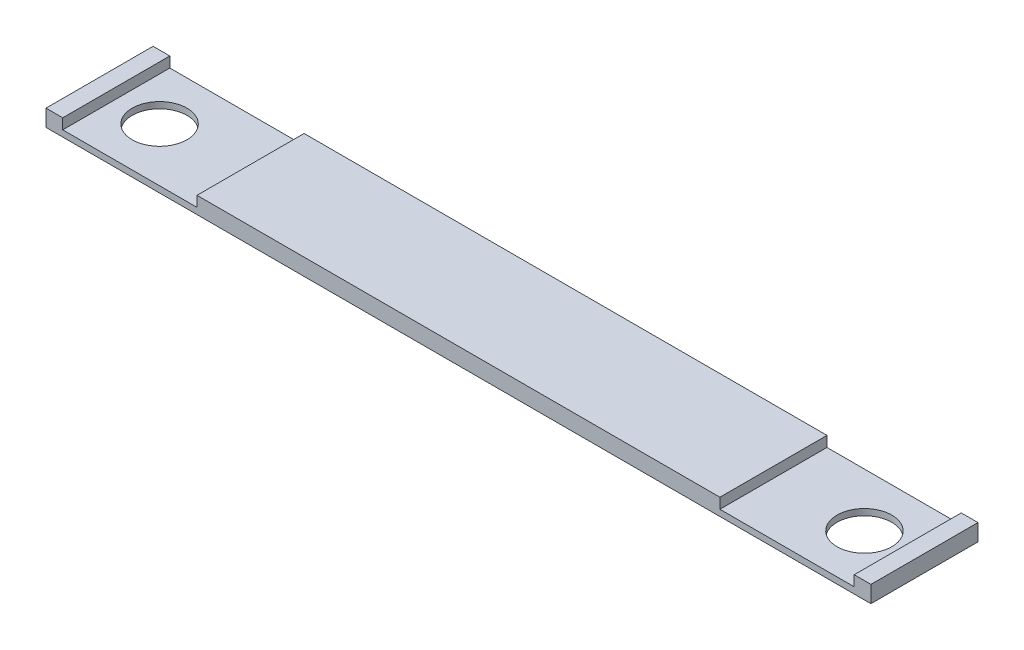
ISO-10303-21;
HEADER;
FILE_DESCRIPTION(('STEP AP214'),'2;1');
FILE_NAME('part.step','',(''),(''),'','','');
FILE_SCHEMA(('AUTOMOTIVE_DESIGN { 1 0 10303 214 1 1 1 1 }'));
ENDSEC;
DATA;
#1=APPLICATION_CONTEXT('core data for automotive mechanical design processes');
#2=APPLICATION_PROTOCOL_DEFINITION('international standard','automotive_design',2000,#1);
#3=PRODUCT_CONTEXT('',#1,'mechanical');
#4=PRODUCT('Part','Part','',(#3));
#5=PRODUCT_RELATED_PRODUCT_CATEGORY('part','',(#4));
#6=PRODUCT_DEFINITION_FORMATION('','',#4);
#7=PRODUCT_DEFINITION_CONTEXT('part definition',#1,'design');
#8=PRODUCT_DEFINITION('design','',#6,#7);
#9=PRODUCT_DEFINITION_SHAPE('','',#8);
#10=(LENGTH_UNIT() NAMED_UNIT(*) SI_UNIT(.MILLI.,.METRE.));
#11=(NAMED_UNIT(*) PLANE_ANGLE_UNIT() SI_UNIT($,.RADIAN.));
#12=(NAMED_UNIT(*) SI_UNIT($,.STERADIAN.) SOLID_ANGLE_UNIT());
#13=UNCERTAINTY_MEASURE_WITH_UNIT(LENGTH_MEASURE(1.E-05),#10,'distance_accuracy_value','');
#14=(GEOMETRIC_REPRESENTATION_CONTEXT(3) GLOBAL_UNCERTAINTY_ASSIGNED_CONTEXT((#13)) GLOBAL_UNIT_ASSIGNED_CONTEXT((#10,
#11,#12)) REPRESENTATION_CONTEXT('',''));
#15=CARTESIAN_POINT('',(0.,0.,0.));
#16=DIRECTION('',(0.,0.,1.));
#17=DIRECTION('',(1.,0.,0.));
#18=AXIS2_PLACEMENT_3D('',#15,#16,#17);
#19=CARTESIAN_POINT('',(0.,1.5,0.));
#20=DIRECTION('',(0.,1.,0.));
#21=DIRECTION('',(0.,0.,1.));
#22=AXIS2_PLACEMENT_3D('',#19,#20,#21);
#23=PLANE('',#22);
#24=CARTESIAN_POINT('',(84.2499999999857,1.5,0.));
#25=DIRECTION('',(0.,1.,0.));
#26=DIRECTION('',(0.,0.,1.));
#27=AXIS2_PLACEMENT_3D('',#24,#25,#26);
#28=CIRCLE('',#27,6.55000000001973);
#29=CARTESIAN_POINT('',(84.2499999999857,1.5,6.55000000001973));
#30=VERTEX_POINT('',#29);
#31=EDGE_CURVE('E208',#30,#30,#28,.T.);
#32=ORIENTED_EDGE('',*,*,#31,.F.);
#33=EDGE_LOOP('',(#32));
#34=FACE_BOUND('',#33,.T.);
#35=DIRECTION('',(1.,0.,0.));
#36=VECTOR('',#35,1.);
#37=CARTESIAN_POINT('',(-98.5999999999858,1.5,12.8));
#38=LINE('',#37,#36);
#39=CARTESIAN_POINT('',(62.5,1.5,12.8));
#40=VERTEX_POINT('',#39);
#41=CARTESIAN_POINT('',(94.5999999999858,1.5,12.8));
#42=VERTEX_POINT('',#41);
#43=EDGE_CURVE('E63',#40,#42,#38,.T.);
#44=ORIENTED_EDGE('',*,*,#43,.T.);
#45=DIRECTION('',(0.,0.,1.));
#46=VECTOR('',#45,1.);
#47=CARTESIAN_POINT('',(94.5999999999858,1.5,-12.8));
#48=LINE('',#47,#46);
#49=CARTESIAN_POINT('',(94.5999999999858,1.5,-12.8));
#50=VERTEX_POINT('',#49);
#51=EDGE_CURVE('E58',#50,#42,#48,.T.);
#52=ORIENTED_EDGE('',*,*,#51,.F.);
#53=DIRECTION('',(-1.,0.,0.));
#54=VECTOR('',#53,1.);
#55=CARTESIAN_POINT('',(-98.5999999999858,1.5,-12.8));
#56=LINE('',#55,#54);
#57=CARTESIAN_POINT('',(62.5,1.5,-12.8));
#58=VERTEX_POINT('',#57);
#59=EDGE_CURVE('E146',#50,#58,#56,.T.);
#60=ORIENTED_EDGE('',*,*,#59,.T.);
#61=DIRECTION('',(0.,0.,-1.));
#62=VECTOR('',#61,1.);
#63=CARTESIAN_POINT('',(62.5,1.5,-12.8));
#64=LINE('',#63,#62);
#65=EDGE_CURVE('E170',#40,#58,#64,.T.);
#66=ORIENTED_EDGE('',*,*,#65,.F.);
#67=EDGE_LOOP('',(#44,#52,#60,#66));
#68=FACE_BOUND('',#67,.T.);
#69=ADVANCED_FACE('F43',(#34,#68),#23,.T.);
#70=CARTESIAN_POINT('',(-84.2499999999858,1.5,1.95399252334028E-11));
#71=DIRECTION('',(0.,1.,0.));
#72=DIRECTION('',(0.,0.,1.));
#73=AXIS2_PLACEMENT_3D('',#70,#71,#72);
#74=CIRCLE('',#73,6.55000000001973);
#75=CARTESIAN_POINT('',(-84.2499999999858,1.5,6.55000000003927));
#76=VERTEX_POINT('',#75);
#77=EDGE_CURVE('E214',#76,#76,#74,.T.);
#78=ORIENTED_EDGE('',*,*,#77,.F.);
#79=EDGE_LOOP('',(#78));
#80=FACE_BOUND('',#79,.T.);
#81=CARTESIAN_POINT('',(-62.5,1.5,-12.8));
#82=VERTEX_POINT('',#81);
#83=CARTESIAN_POINT('',(-94.5999999999858,1.5,-12.8));
#84=VERTEX_POINT('',#83);
#85=EDGE_CURVE('E221',#82,#84,#56,.T.);
#86=ORIENTED_EDGE('',*,*,#85,.T.);
#87=DIRECTION('',(0.,0.,-1.));
#88=VECTOR('',#87,1.);
#89=CARTESIAN_POINT('',(-94.5999999999858,1.5,-12.8));
#90=LINE('',#89,#88);
#91=CARTESIAN_POINT('',(-94.5999999999858,1.5,12.8));
#92=VERTEX_POINT('',#91);
#93=EDGE_CURVE('E167',#92,#84,#90,.T.);
#94=ORIENTED_EDGE('',*,*,#93,.F.);
#95=CARTESIAN_POINT('',(-62.5,1.5,12.8));
#96=VERTEX_POINT('',#95);
#97=EDGE_CURVE('E222',#92,#96,#38,.T.);
#98=ORIENTED_EDGE('',*,*,#97,.T.);
#99=DIRECTION('',(0.,0.,1.));
#100=VECTOR('',#99,1.);
#101=CARTESIAN_POINT('',(-62.5,1.5,-12.8));
#102=LINE('',#101,#100);
#103=EDGE_CURVE('E192',#82,#96,#102,.T.);
#104=ORIENTED_EDGE('',*,*,#103,.F.);
#105=EDGE_LOOP('',(#86,#94,#98,#104));
#106=FACE_BOUND('',#105,.T.);
#107=ADVANCED_FACE('F267',(#80,#106),#23,.T.);
#108=CARTESIAN_POINT('',(0.,0.,0.));
#109=DIRECTION('',(0.,1.,0.));
#110=DIRECTION('',(0.,0.,1.));
#111=AXIS2_PLACEMENT_3D('',#108,#109,#110);
#112=PLANE('',#111);
#113=DIRECTION('',(0.,0.,-1.));
#114=VECTOR('',#113,1.);
#115=CARTESIAN_POINT('',(98.5999999999858,0.,-12.8));
#116=LINE('',#115,#114);
#117=CARTESIAN_POINT('',(98.5999999999858,0.,12.8));
#118=VERTEX_POINT('',#117);
#119=CARTESIAN_POINT('',(98.5999999999858,0.,-12.8));
#120=VERTEX_POINT('',#119);
#121=EDGE_CURVE('E217',#118,#120,#116,.T.);
#122=ORIENTED_EDGE('',*,*,#121,.F.);
#123=DIRECTION('',(1.,0.,0.));
#124=VECTOR('',#123,1.);
#125=CARTESIAN_POINT('',(-98.5999999999858,0.,12.8));
#126=LINE('',#125,#124);
#127=CARTESIAN_POINT('',(-98.5999999999858,0.,12.8));
#128=VERTEX_POINT('',#127);
#129=EDGE_CURVE('E231',#128,#118,#126,.T.);
#130=ORIENTED_EDGE('',*,*,#129,.F.);
#131=DIRECTION('',(0.,0.,1.));
#132=VECTOR('',#131,1.);
#133=CARTESIAN_POINT('',(-98.5999999999858,0.,-12.8));
#134=LINE('',#133,#132);
#135=CARTESIAN_POINT('',(-98.5999999999858,0.,-12.8));
#136=VERTEX_POINT('',#135);
#137=EDGE_CURVE('E229',#136,#128,#134,.T.);
#138=ORIENTED_EDGE('',*,*,#137,.F.);
#139=DIRECTION('',(-1.,0.,0.));
#140=VECTOR('',#139,1.);
#141=CARTESIAN_POINT('',(-98.5999999999858,0.,-12.8));
#142=LINE('',#141,#140);
#143=EDGE_CURVE('E227',#120,#136,#142,.T.);
#144=ORIENTED_EDGE('',*,*,#143,.F.);
#145=EDGE_LOOP('',(#122,#130,#138,#144));
#146=FACE_BOUND('',#145,.T.);
#147=CARTESIAN_POINT('',(-84.2499999999858,0.,1.95399252334028E-11));
#148=DIRECTION('',(0.,1.,0.));
#149=DIRECTION('',(0.,0.,1.));
#150=AXIS2_PLACEMENT_3D('',#147,#148,#149);
#151=CIRCLE('',#150,6.55000000001973);
#152=CARTESIAN_POINT('',(-84.2499999999858,0.,6.55000000003927));
#153=VERTEX_POINT('',#152);
#154=EDGE_CURVE('E211',#153,#153,#151,.T.);
#155=ORIENTED_EDGE('',*,*,#154,.T.);
#156=EDGE_LOOP('',(#155));
#157=FACE_BOUND('',#156,.T.);
#158=CARTESIAN_POINT('',(84.2499999999857,0.,0.));
#159=DIRECTION('',(0.,1.,0.));
#160=DIRECTION('',(0.,0.,1.));
#161=AXIS2_PLACEMENT_3D('',#158,#159,#160);
#162=CIRCLE('',#161,6.55000000001973);
#163=CARTESIAN_POINT('',(84.2499999999857,0.,6.55000000001973));
#164=VERTEX_POINT('',#163);
#165=EDGE_CURVE('E189',#164,#164,#162,.T.);
#166=ORIENTED_EDGE('',*,*,#165,.T.);
#167=EDGE_LOOP('',(#166));
#168=FACE_BOUND('',#167,.T.);
#169=ADVANCED_FACE('F246',(#146,#157,#168),#112,.F.);
#170=CARTESIAN_POINT('',(98.5999999999858,1.5,-12.8));
#171=DIRECTION('',(-1.,0.,0.));
#172=DIRECTION('',(0.,0.,1.));
#173=AXIS2_PLACEMENT_3D('',#170,#171,#172);
#174=PLANE('',#173);
#175=ORIENTED_EDGE('',*,*,#121,.T.);
#176=DIRECTION('',(0.,-1.,0.));
#177=VECTOR('',#176,1.);
#178=CARTESIAN_POINT('',(98.5999999999858,1.5,-12.8));
#179=LINE('',#178,#177);
#180=CARTESIAN_POINT('',(98.5999999999858,4.00000000000011,-12.8));
#181=VERTEX_POINT('',#180);
#182=EDGE_CURVE('E11',#181,#120,#179,.T.);
#183=ORIENTED_EDGE('',*,*,#182,.F.);
#184=DIRECTION('',(0.,0.,1.));
#185=VECTOR('',#184,1.);
#186=CARTESIAN_POINT('',(98.5999999999858,4.00000000000011,-12.8));
#187=LINE('',#186,#185);
#188=CARTESIAN_POINT('',(98.5999999999858,4.00000000000011,12.8));
#189=VERTEX_POINT('',#188);
#190=EDGE_CURVE('E139',#181,#189,#187,.T.);
#191=ORIENTED_EDGE('',*,*,#190,.T.);
#192=DIRECTION('',(0.,-1.,0.));
#193=VECTOR('',#192,1.);
#194=CARTESIAN_POINT('',(98.5999999999858,1.5,12.8));
#195=LINE('',#194,#193);
#196=EDGE_CURVE('E224',#189,#118,#195,.T.);
#197=ORIENTED_EDGE('',*,*,#196,.T.);
#198=EDGE_LOOP('',(#175,#183,#191,#197));
#199=FACE_BOUND('',#198,.T.);
#200=ADVANCED_FACE('F45',(#199),#174,.F.);
#201=CARTESIAN_POINT('',(-98.5999999999858,1.5,-12.8));
#202=DIRECTION('',(0.,0.,1.));
#203=DIRECTION('',(1.,0.,0.));
#204=AXIS2_PLACEMENT_3D('',#201,#202,#203);
#205=PLANE('',#204);
#206=ORIENTED_EDGE('',*,*,#143,.T.);
#207=DIRECTION('',(0.,-1.,0.));
#208=VECTOR('',#207,1.);
#209=CARTESIAN_POINT('',(-98.5999999999858,1.5,-12.8));
#210=LINE('',#209,#208);
#211=CARTESIAN_POINT('',(-98.5999999999858,4.00000000000011,-12.8));
#212=VERTEX_POINT('',#211);
#213=EDGE_CURVE('E51',#212,#136,#210,.T.);
#214=ORIENTED_EDGE('',*,*,#213,.F.);
#215=DIRECTION('',(1.,0.,0.));
#216=VECTOR('',#215,1.);
#217=CARTESIAN_POINT('',(-98.5999999999858,4.00000000000011,-12.8));
#218=LINE('',#217,#216);
#219=CARTESIAN_POINT('',(-94.5999999999858,4.00000000000011,-12.8));
#220=VERTEX_POINT('',#219);
#221=EDGE_CURVE('E157',#212,#220,#218,.T.);
#222=ORIENTED_EDGE('',*,*,#221,.T.);
#223=DIRECTION('',(0.,-1.,0.));
#224=VECTOR('',#223,1.);
#225=CARTESIAN_POINT('',(-94.5999999999858,131.594513988651,-12.8));
#226=LINE('',#225,#224);
#227=EDGE_CURVE('E164',#220,#84,#226,.T.);
#228=ORIENTED_EDGE('',*,*,#227,.T.);
#229=ORIENTED_EDGE('',*,*,#85,.F.);
#230=DIRECTION('',(0.,-1.,0.));
#231=VECTOR('',#230,1.);
#232=CARTESIAN_POINT('',(-62.5,131.594513988651,-12.8));
#233=LINE('',#232,#231);
#234=CARTESIAN_POINT('',(-62.5,4.00000000000011,-12.8));
#235=VERTEX_POINT('',#234);
#236=EDGE_CURVE('E201',#235,#82,#233,.T.);
#237=ORIENTED_EDGE('',*,*,#236,.F.);
#238=DIRECTION('',(1.,0.,0.));
#239=VECTOR('',#238,1.);
#240=CARTESIAN_POINT('',(-62.5,4.00000000000011,-12.8));
#241=LINE('',#240,#239);
#242=CARTESIAN_POINT('',(62.5,4.00000000000011,-12.8));
#243=VERTEX_POINT('',#242);
#244=EDGE_CURVE('E182',#235,#243,#241,.T.);
#245=ORIENTED_EDGE('',*,*,#244,.T.);
#246=DIRECTION('',(0.,-1.,0.));
#247=VECTOR('',#246,1.);
#248=CARTESIAN_POINT('',(62.5,131.594513988651,-12.8));
#249=LINE('',#248,#247);
#250=EDGE_CURVE('E204',#243,#58,#249,.T.);
#251=ORIENTED_EDGE('',*,*,#250,.T.);
#252=ORIENTED_EDGE('',*,*,#59,.F.);
#253=DIRECTION('',(0.,-1.,0.));
#254=VECTOR('',#253,1.);
#255=CARTESIAN_POINT('',(94.5999999999858,131.594513988651,-12.8));
#256=LINE('',#255,#254);
#257=CARTESIAN_POINT('',(94.5999999999858,4.00000000000011,-12.8));
#258=VERTEX_POINT('',#257);
#259=EDGE_CURVE('E143',#258,#50,#256,.T.);
#260=ORIENTED_EDGE('',*,*,#259,.F.);
#261=DIRECTION('',(1.,0.,0.));
#262=VECTOR('',#261,1.);
#263=CARTESIAN_POINT('',(98.5999999999858,4.00000000000011,-12.8));
#264=LINE('',#263,#262);
#265=EDGE_CURVE('E131',#258,#181,#264,.T.);
#266=ORIENTED_EDGE('',*,*,#265,.T.);
#267=ORIENTED_EDGE('',*,*,#182,.T.);
#268=EDGE_LOOP('',(#206,#214,#222,#228,#229,#237,#245,#251,#252,#260,#266,#267));
#269=FACE_BOUND('',#268,.T.);
#270=ADVANCED_FACE('F144',(#269),#205,.F.);
#271=CARTESIAN_POINT('',(-98.5999999999858,1.5,-12.8));
#272=DIRECTION('',(1.,0.,0.));
#273=DIRECTION('',(0.,0.,-1.));
#274=AXIS2_PLACEMENT_3D('',#271,#272,#273);
#275=PLANE('',#274);
#276=ORIENTED_EDGE('',*,*,#137,.T.);
#277=DIRECTION('',(0.,-1.,0.));
#278=VECTOR('',#277,1.);
#279=CARTESIAN_POINT('',(-98.5999999999858,1.5,12.8));
#280=LINE('',#279,#278);
#281=CARTESIAN_POINT('',(-98.5999999999858,4.00000000000011,12.8));
#282=VERTEX_POINT('',#281);
#283=EDGE_CURVE('E235',#282,#128,#280,.T.);
#284=ORIENTED_EDGE('',*,*,#283,.F.);
#285=DIRECTION('',(0.,0.,-1.));
#286=VECTOR('',#285,1.);
#287=CARTESIAN_POINT('',(-98.5999999999858,4.00000000000011,-12.8));
#288=LINE('',#287,#286);
#289=EDGE_CURVE('E171',#282,#212,#288,.T.);
#290=ORIENTED_EDGE('',*,*,#289,.T.);
#291=ORIENTED_EDGE('',*,*,#213,.T.);
#292=EDGE_LOOP('',(#276,#284,#290,#291));
#293=FACE_BOUND('',#292,.T.);
#294=ADVANCED_FACE('F240',(#293),#275,.F.);
#295=CARTESIAN_POINT('',(-98.5999999999858,1.5,12.8));
#296=DIRECTION('',(0.,0.,-1.));
#297=DIRECTION('',(-1.,0.,0.));
#298=AXIS2_PLACEMENT_3D('',#295,#296,#297);
#299=PLANE('',#298);
#300=ORIENTED_EDGE('',*,*,#129,.T.);
#301=ORIENTED_EDGE('',*,*,#196,.F.);
#302=DIRECTION('',(-1.,0.,0.));
#303=VECTOR('',#302,1.);
#304=CARTESIAN_POINT('',(98.5999999999858,4.00000000000011,12.8));
#305=LINE('',#304,#303);
#306=CARTESIAN_POINT('',(94.5999999999858,4.00000000000011,12.8));
#307=VERTEX_POINT('',#306);
#308=EDGE_CURVE('E149',#189,#307,#305,.T.);
#309=ORIENTED_EDGE('',*,*,#308,.T.);
#310=DIRECTION('',(0.,-1.,0.));
#311=VECTOR('',#310,1.);
#312=CARTESIAN_POINT('',(94.5999999999858,131.594513988651,12.8));
#313=LINE('',#312,#311);
#314=EDGE_CURVE('E148',#307,#42,#313,.T.);
#315=ORIENTED_EDGE('',*,*,#314,.T.);
#316=ORIENTED_EDGE('',*,*,#43,.F.);
#317=DIRECTION('',(0.,-1.,0.));
#318=VECTOR('',#317,1.);
#319=CARTESIAN_POINT('',(62.5,131.594513988651,12.8));
#320=LINE('',#319,#318);
#321=CARTESIAN_POINT('',(62.5,4.00000000000011,12.8));
#322=VERTEX_POINT('',#321);
#323=EDGE_CURVE('E195',#322,#40,#320,.T.);
#324=ORIENTED_EDGE('',*,*,#323,.F.);
#325=DIRECTION('',(-1.,0.,0.));
#326=VECTOR('',#325,1.);
#327=CARTESIAN_POINT('',(-62.5,4.00000000000011,12.8));
#328=LINE('',#327,#326);
#329=CARTESIAN_POINT('',(-62.5,4.00000000000011,12.8));
#330=VERTEX_POINT('',#329);
#331=EDGE_CURVE('E183',#322,#330,#328,.T.);
#332=ORIENTED_EDGE('',*,*,#331,.T.);
#333=DIRECTION('',(0.,-1.,0.));
#334=VECTOR('',#333,1.);
#335=CARTESIAN_POINT('',(-62.5,131.594513988651,12.8));
#336=LINE('',#335,#334);
#337=EDGE_CURVE('E198',#330,#96,#336,.T.);
#338=ORIENTED_EDGE('',*,*,#337,.T.);
#339=ORIENTED_EDGE('',*,*,#97,.F.);
#340=DIRECTION('',(0.,-1.,0.));
#341=VECTOR('',#340,1.);
#342=CARTESIAN_POINT('',(-94.5999999999858,131.594513988651,12.8));
#343=LINE('',#342,#341);
#344=CARTESIAN_POINT('',(-94.5999999999858,4.00000000000011,12.8));
#345=VERTEX_POINT('',#344);
#346=EDGE_CURVE('E160',#345,#92,#343,.T.);
#347=ORIENTED_EDGE('',*,*,#346,.F.);
#348=DIRECTION('',(-1.,0.,0.));
#349=VECTOR('',#348,1.);
#350=CARTESIAN_POINT('',(-98.5999999999858,4.00000000000011,12.8));
#351=LINE('',#350,#349);
#352=EDGE_CURVE('E174',#345,#282,#351,.T.);
#353=ORIENTED_EDGE('',*,*,#352,.T.);
#354=ORIENTED_EDGE('',*,*,#283,.T.);
#355=EDGE_LOOP('',(#300,#301,#309,#315,#316,#324,#332,#338,#339,#347,#353,#354));
#356=FACE_BOUND('',#355,.T.);
#357=ADVANCED_FACE('F249',(#356),#299,.F.);
#358=CARTESIAN_POINT('',(-84.2499999999858,1.5,1.95399252334028E-11));
#359=DIRECTION('',(0.,-1.,0.));
#360=DIRECTION('',(0.,0.,-1.));
#361=AXIS2_PLACEMENT_3D('',#358,#359,#360);
#362=CYLINDRICAL_SURFACE('',#361,6.55000000001973);
#363=ORIENTED_EDGE('',*,*,#77,.T.);
#364=EDGE_LOOP('',(#363));
#365=FACE_BOUND('',#364,.T.);
#366=ORIENTED_EDGE('',*,*,#154,.F.);
#367=EDGE_LOOP('',(#366));
#368=FACE_BOUND('',#367,.T.);
#369=ADVANCED_FACE('F292',(#365,#368),#362,.F.);
#370=CARTESIAN_POINT('',(84.2499999999857,1.5,0.));
#371=DIRECTION('',(0.,-1.,0.));
#372=DIRECTION('',(0.,0.,-1.));
#373=AXIS2_PLACEMENT_3D('',#370,#371,#372);
#374=CYLINDRICAL_SURFACE('',#373,6.55000000001973);
#375=ORIENTED_EDGE('',*,*,#31,.T.);
#376=EDGE_LOOP('',(#375));
#377=FACE_BOUND('',#376,.T.);
#378=ORIENTED_EDGE('',*,*,#165,.F.);
#379=EDGE_LOOP('',(#378));
#380=FACE_BOUND('',#379,.T.);
#381=ADVANCED_FACE('F327',(#377,#380),#374,.F.);
#382=CARTESIAN_POINT('',(-62.5,131.594513988651,-12.8));
#383=DIRECTION('',(1.,0.,0.));
#384=DIRECTION('',(0.,0.,-1.));
#385=AXIS2_PLACEMENT_3D('',#382,#383,#384);
#386=PLANE('',#385);
#387=ORIENTED_EDGE('',*,*,#337,.F.);
#388=DIRECTION('',(0.,0.,-1.));
#389=VECTOR('',#388,1.);
#390=CARTESIAN_POINT('',(-62.5,4.00000000000011,-12.8));
#391=LINE('',#390,#389);
#392=EDGE_CURVE('E179',#330,#235,#391,.T.);
#393=ORIENTED_EDGE('',*,*,#392,.T.);
#394=ORIENTED_EDGE('',*,*,#236,.T.);
#395=ORIENTED_EDGE('',*,*,#103,.T.);
#396=EDGE_LOOP('',(#387,#393,#394,#395));
#397=FACE_BOUND('',#396,.T.);
#398=ADVANCED_FACE('F264',(#397),#386,.F.);
#399=CARTESIAN_POINT('',(62.5,131.594513988651,-12.8));
#400=DIRECTION('',(-1.,0.,0.));
#401=DIRECTION('',(0.,0.,1.));
#402=AXIS2_PLACEMENT_3D('',#399,#400,#401);
#403=PLANE('',#402);
#404=ORIENTED_EDGE('',*,*,#250,.F.);
#405=DIRECTION('',(0.,0.,1.));
#406=VECTOR('',#405,1.);
#407=CARTESIAN_POINT('',(62.5,4.00000000000011,-12.8));
#408=LINE('',#407,#406);
#409=EDGE_CURVE('E186',#243,#322,#408,.T.);
#410=ORIENTED_EDGE('',*,*,#409,.T.);
#411=ORIENTED_EDGE('',*,*,#323,.T.);
#412=ORIENTED_EDGE('',*,*,#65,.T.);
#413=EDGE_LOOP('',(#404,#410,#411,#412));
#414=FACE_BOUND('',#413,.T.);
#415=ADVANCED_FACE('F256',(#414),#403,.F.);
#416=CARTESIAN_POINT('',(53.131999999989,4.00000000000011,0.));
#417=DIRECTION('',(0.,-1.,0.));
#418=DIRECTION('',(0.,0.,-1.));
#419=AXIS2_PLACEMENT_3D('',#416,#417,#418);
#420=PLANE('',#419);
#421=ORIENTED_EDGE('',*,*,#244,.F.);
#422=ORIENTED_EDGE('',*,*,#392,.F.);
#423=ORIENTED_EDGE('',*,*,#331,.F.);
#424=ORIENTED_EDGE('',*,*,#409,.F.);
#425=EDGE_LOOP('',(#421,#422,#423,#424));
#426=FACE_BOUND('',#425,.T.);
#427=ADVANCED_FACE('F258',(#426),#420,.F.);
#428=CARTESIAN_POINT('',(-94.5999999999858,131.594513988651,-12.8));
#429=DIRECTION('',(-1.,0.,0.));
#430=DIRECTION('',(0.,0.,1.));
#431=AXIS2_PLACEMENT_3D('',#428,#429,#430);
#432=PLANE('',#431);
#433=ORIENTED_EDGE('',*,*,#227,.F.);
#434=DIRECTION('',(0.,0.,1.));
#435=VECTOR('',#434,1.);
#436=CARTESIAN_POINT('',(-94.5999999999858,4.00000000000011,-12.8));
#437=LINE('',#436,#435);
#438=EDGE_CURVE('E161',#220,#345,#437,.T.);
#439=ORIENTED_EDGE('',*,*,#438,.T.);
#440=ORIENTED_EDGE('',*,*,#346,.T.);
#441=ORIENTED_EDGE('',*,*,#93,.T.);
#442=EDGE_LOOP('',(#433,#439,#440,#441));
#443=FACE_BOUND('',#442,.T.);
#444=ADVANCED_FACE('F270',(#443),#432,.F.);
#445=CARTESIAN_POINT('',(53.131999999989,4.00000000000011,0.));
#446=DIRECTION('',(0.,-1.,0.));
#447=DIRECTION('',(0.,0.,-1.));
#448=AXIS2_PLACEMENT_3D('',#445,#446,#447);
#449=PLANE('',#448);
#450=ORIENTED_EDGE('',*,*,#352,.F.);
#451=ORIENTED_EDGE('',*,*,#438,.F.);
#452=ORIENTED_EDGE('',*,*,#221,.F.);
#453=ORIENTED_EDGE('',*,*,#289,.F.);
#454=EDGE_LOOP('',(#450,#451,#452,#453));
#455=FACE_BOUND('',#454,.T.);
#456=ADVANCED_FACE('F272',(#455),#449,.F.);
#457=CARTESIAN_POINT('',(94.5999999999858,131.594513988651,-12.8));
#458=DIRECTION('',(1.,0.,0.));
#459=DIRECTION('',(0.,0.,-1.));
#460=AXIS2_PLACEMENT_3D('',#457,#458,#459);
#461=PLANE('',#460);
#462=ORIENTED_EDGE('',*,*,#314,.F.);
#463=DIRECTION('',(0.,0.,-1.));
#464=VECTOR('',#463,1.);
#465=CARTESIAN_POINT('',(94.5999999999858,4.00000000000011,-12.8));
#466=LINE('',#465,#464);
#467=EDGE_CURVE('E136',#307,#258,#466,.T.);
#468=ORIENTED_EDGE('',*,*,#467,.T.);
#469=ORIENTED_EDGE('',*,*,#259,.T.);
#470=ORIENTED_EDGE('',*,*,#51,.T.);
#471=EDGE_LOOP('',(#462,#468,#469,#470));
#472=FACE_BOUND('',#471,.T.);
#473=ADVANCED_FACE('F151',(#472),#461,.F.);
#474=CARTESIAN_POINT('',(53.131999999989,4.00000000000011,0.));
#475=DIRECTION('',(0.,-1.,0.));
#476=DIRECTION('',(0.,0.,-1.));
#477=AXIS2_PLACEMENT_3D('',#474,#475,#476);
#478=PLANE('',#477);
#479=ORIENTED_EDGE('',*,*,#265,.F.);
#480=ORIENTED_EDGE('',*,*,#467,.F.);
#481=ORIENTED_EDGE('',*,*,#308,.F.);
#482=ORIENTED_EDGE('',*,*,#190,.F.);
#483=EDGE_LOOP('',(#479,#480,#481,#482));
#484=FACE_BOUND('',#483,.T.);
#485=ADVANCED_FACE('F133',(#484),#478,.F.);
#486=CLOSED_SHELL('',(#69,#107,#169,#200,#270,#294,#357,#369,#381,#398,#415,#427,#444,#456,#473,#485));
#487=MANIFOLD_SOLID_BREP('B2',#486);
#488=ADVANCED_BREP_SHAPE_REPRESENTATION('',(#18,#487),#14);
#489=SHAPE_DEFINITION_REPRESENTATION(#9,#488);
ENDSEC;
END-ISO-10303-21;
